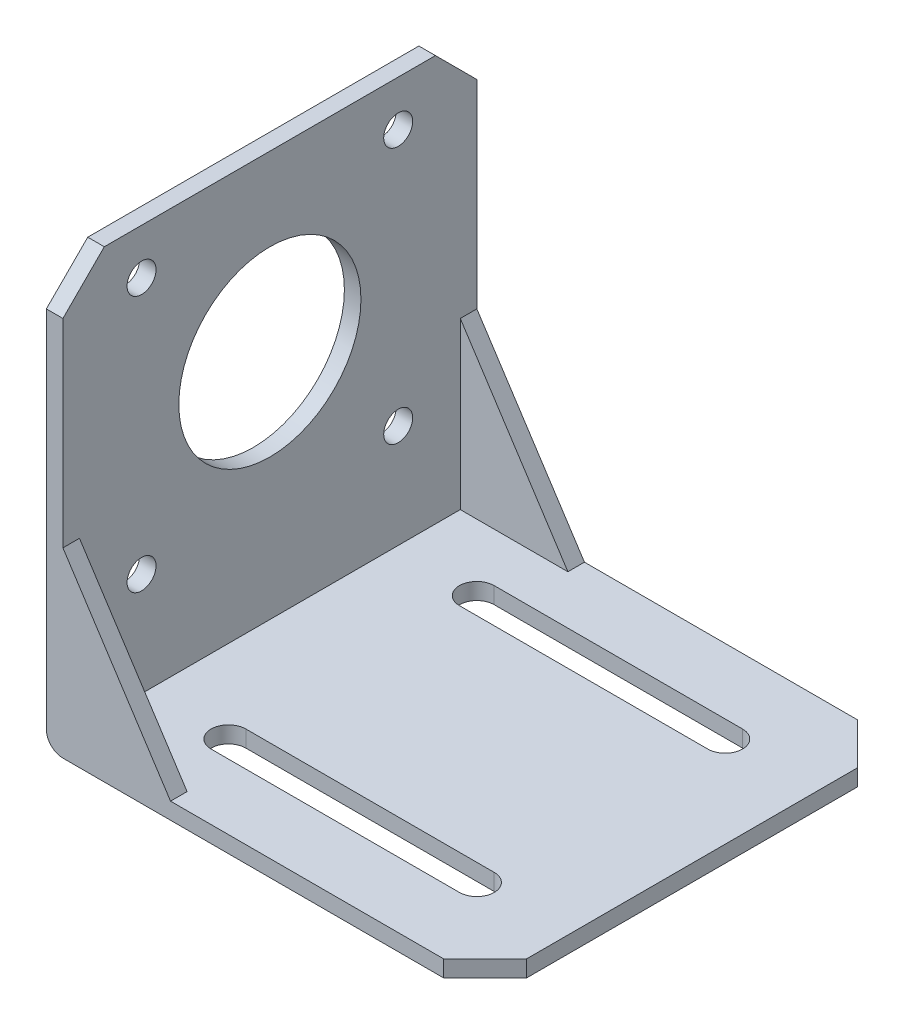
ISO-10303-21;
HEADER;
FILE_DESCRIPTION(('STEP AP214'),'2;1');
FILE_NAME('part.step','',(''),(''),'','','');
FILE_SCHEMA(('AUTOMOTIVE_DESIGN { 1 0 10303 214 1 1 1 1 }'));
ENDSEC;
DATA;
#1=APPLICATION_CONTEXT('core data for automotive mechanical design processes');
#2=APPLICATION_PROTOCOL_DEFINITION('international standard','automotive_design',2000,#1);
#3=PRODUCT_CONTEXT('',#1,'mechanical');
#4=PRODUCT('Part','Part','',(#3));
#5=PRODUCT_RELATED_PRODUCT_CATEGORY('part','',(#4));
#6=PRODUCT_DEFINITION_FORMATION('','',#4);
#7=PRODUCT_DEFINITION_CONTEXT('part definition',#1,'design');
#8=PRODUCT_DEFINITION('design','',#6,#7);
#9=PRODUCT_DEFINITION_SHAPE('','',#8);
#10=(LENGTH_UNIT() NAMED_UNIT(*) SI_UNIT(.MILLI.,.METRE.));
#11=(NAMED_UNIT(*) PLANE_ANGLE_UNIT() SI_UNIT($,.RADIAN.));
#12=(NAMED_UNIT(*) SI_UNIT($,.STERADIAN.) SOLID_ANGLE_UNIT());
#13=UNCERTAINTY_MEASURE_WITH_UNIT(LENGTH_MEASURE(1.E-05),#10,'distance_accuracy_value','');
#14=(GEOMETRIC_REPRESENTATION_CONTEXT(3) GLOBAL_UNCERTAINTY_ASSIGNED_CONTEXT((#13)) GLOBAL_UNIT_ASSIGNED_CONTEXT((#10,
#11,#12)) REPRESENTATION_CONTEXT('',''));
#15=CARTESIAN_POINT('',(0.,0.,0.));
#16=DIRECTION('',(0.,0.,1.));
#17=DIRECTION('',(1.,0.,0.));
#18=AXIS2_PLACEMENT_3D('',#15,#16,#17);
#19=CARTESIAN_POINT('',(0.,2.,0.));
#20=DIRECTION('',(0.,-1.,0.));
#21=DIRECTION('',(0.,0.,-1.));
#22=AXIS2_PLACEMENT_3D('',#19,#20,#21);
#23=PLANE('',#22);
#24=CARTESIAN_POINT('',(12.,2.,-15.));
#25=DIRECTION('',(0.,1.,0.));
#26=DIRECTION('',(0.,0.,1.));
#27=AXIS2_PLACEMENT_3D('',#24,#25,#26);
#28=CIRCLE('',#27,2.1);
#29=CARTESIAN_POINT('',(12.,2.,-17.1));
#30=VERTEX_POINT('',#29);
#31=CARTESIAN_POINT('',(12.,2.,-12.9));
#32=VERTEX_POINT('',#31);
#33=EDGE_CURVE('E406',#30,#32,#28,.T.);
#34=ORIENTED_EDGE('',*,*,#33,.F.);
#35=DIRECTION('',(-1.,0.,0.));
#36=VECTOR('',#35,1.);
#37=CARTESIAN_POINT('',(12.,2.,-17.1));
#38=LINE('',#37,#36);
#39=CARTESIAN_POINT('',(42.,2.,-17.1));
#40=VERTEX_POINT('',#39);
#41=EDGE_CURVE('E417',#40,#30,#38,.T.);
#42=ORIENTED_EDGE('',*,*,#41,.F.);
#43=CARTESIAN_POINT('',(42.,2.,-15.));
#44=DIRECTION('',(0.,1.,0.));
#45=DIRECTION('',(0.,0.,1.));
#46=AXIS2_PLACEMENT_3D('',#43,#44,#45);
#47=CIRCLE('',#46,2.1);
#48=CARTESIAN_POINT('',(42.,2.,-12.9));
#49=VERTEX_POINT('',#48);
#50=EDGE_CURVE('E413',#49,#40,#47,.T.);
#51=ORIENTED_EDGE('',*,*,#50,.F.);
#52=DIRECTION('',(1.,0.,0.));
#53=VECTOR('',#52,1.);
#54=CARTESIAN_POINT('',(12.,2.,-12.9));
#55=LINE('',#54,#53);
#56=EDGE_CURVE('E409',#32,#49,#55,.T.);
#57=ORIENTED_EDGE('',*,*,#56,.F.);
#58=EDGE_LOOP('',(#34,#42,#51,#57));
#59=FACE_BOUND('',#58,.T.);
#60=DIRECTION('',(-1.,0.,0.));
#61=VECTOR('',#60,1.);
#62=CARTESIAN_POINT('',(12.,2.,17.1));
#63=LINE('',#62,#61);
#64=CARTESIAN_POINT('',(42.,2.,17.1));
#65=VERTEX_POINT('',#64);
#66=CARTESIAN_POINT('',(12.,2.,17.1));
#67=VERTEX_POINT('',#66);
#68=EDGE_CURVE('E296',#65,#67,#63,.T.);
#69=ORIENTED_EDGE('',*,*,#68,.T.);
#70=CARTESIAN_POINT('',(12.,2.,15.));
#71=DIRECTION('',(0.,-1.,0.));
#72=DIRECTION('',(0.,0.,-1.));
#73=AXIS2_PLACEMENT_3D('',#70,#71,#72);
#74=CIRCLE('',#73,2.1);
#75=CARTESIAN_POINT('',(12.,2.,12.9));
#76=VERTEX_POINT('',#75);
#77=EDGE_CURVE('E292',#67,#76,#74,.T.);
#78=ORIENTED_EDGE('',*,*,#77,.T.);
#79=DIRECTION('',(1.,0.,0.));
#80=VECTOR('',#79,1.);
#81=CARTESIAN_POINT('',(12.,2.,12.9));
#82=LINE('',#81,#80);
#83=CARTESIAN_POINT('',(42.,2.,12.9));
#84=VERTEX_POINT('',#83);
#85=EDGE_CURVE('E305',#76,#84,#82,.T.);
#86=ORIENTED_EDGE('',*,*,#85,.T.);
#87=CARTESIAN_POINT('',(42.,2.,15.));
#88=DIRECTION('',(0.,-1.,0.));
#89=DIRECTION('',(0.,0.,-1.));
#90=AXIS2_PLACEMENT_3D('',#87,#88,#89);
#91=CIRCLE('',#90,2.1);
#92=EDGE_CURVE('E301',#84,#65,#91,.T.);
#93=ORIENTED_EDGE('',*,*,#92,.T.);
#94=EDGE_LOOP('',(#69,#78,#86,#93));
#95=FACE_BOUND('',#94,.T.);
#96=DIRECTION('',(0.,0.,-1.));
#97=VECTOR('',#96,1.);
#98=CARTESIAN_POINT('',(15.,2.,-23.));
#99=LINE('',#98,#97);
#100=CARTESIAN_POINT('',(15.,2.,-23.));
#101=VERTEX_POINT('',#100);
#102=CARTESIAN_POINT('',(15.,2.,-25.));
#103=VERTEX_POINT('',#102);
#104=EDGE_CURVE('E61',#101,#103,#99,.T.);
#105=ORIENTED_EDGE('',*,*,#104,.F.);
#106=DIRECTION('',(1.,0.,0.));
#107=VECTOR('',#106,1.);
#108=CARTESIAN_POINT('',(15.,2.,-23.));
#109=LINE('',#108,#107);
#110=CARTESIAN_POINT('',(2.,2.,-23.));
#111=VERTEX_POINT('',#110);
#112=EDGE_CURVE('E224',#111,#101,#109,.T.);
#113=ORIENTED_EDGE('',*,*,#112,.F.);
#114=DIRECTION('',(0.,0.,-1.));
#115=VECTOR('',#114,1.);
#116=CARTESIAN_POINT('',(2.,2.,0.));
#117=LINE('',#116,#115);
#118=CARTESIAN_POINT('',(2.,2.,23.));
#119=VERTEX_POINT('',#118);
#120=EDGE_CURVE('E208',#119,#111,#117,.T.);
#121=ORIENTED_EDGE('',*,*,#120,.F.);
#122=DIRECTION('',(1.,0.,0.));
#123=VECTOR('',#122,1.);
#124=CARTESIAN_POINT('',(15.,2.,23.));
#125=LINE('',#124,#123);
#126=CARTESIAN_POINT('',(15.,2.,23.));
#127=VERTEX_POINT('',#126);
#128=EDGE_CURVE('E235',#119,#127,#125,.T.);
#129=ORIENTED_EDGE('',*,*,#128,.T.);
#130=DIRECTION('',(0.,0.,1.));
#131=VECTOR('',#130,1.);
#132=CARTESIAN_POINT('',(15.,2.,23.));
#133=LINE('',#132,#131);
#134=CARTESIAN_POINT('',(15.,2.,25.));
#135=VERTEX_POINT('',#134);
#136=EDGE_CURVE('E246',#127,#135,#133,.T.);
#137=ORIENTED_EDGE('',*,*,#136,.T.);
#138=DIRECTION('',(-1.,0.,0.));
#139=VECTOR('',#138,1.);
#140=CARTESIAN_POINT('',(0.,2.,25.));
#141=LINE('',#140,#139);
#142=CARTESIAN_POINT('',(48.,2.,25.));
#143=VERTEX_POINT('',#142);
#144=EDGE_CURVE('E336',#143,#135,#141,.T.);
#145=ORIENTED_EDGE('',*,*,#144,.F.);
#146=DIRECTION('',(-0.707106781186546,0.,0.707106781186548));
#147=VECTOR('',#146,1.);
#148=CARTESIAN_POINT('',(48.,2.,25.));
#149=LINE('',#148,#147);
#150=CARTESIAN_POINT('',(53.,2.,20.));
#151=VERTEX_POINT('',#150);
#152=EDGE_CURVE('E340',#151,#143,#149,.T.);
#153=ORIENTED_EDGE('',*,*,#152,.F.);
#154=DIRECTION('',(0.,0.,-1.));
#155=VECTOR('',#154,1.);
#156=CARTESIAN_POINT('',(53.,2.,-20.));
#157=LINE('',#156,#155);
#158=CARTESIAN_POINT('',(53.,2.,-20.));
#159=VERTEX_POINT('',#158);
#160=EDGE_CURVE('E449',#151,#159,#157,.T.);
#161=ORIENTED_EDGE('',*,*,#160,.T.);
#162=DIRECTION('',(-0.707106781186546,0.,-0.707106781186548));
#163=VECTOR('',#162,1.);
#164=CARTESIAN_POINT('',(48.,2.,-25.));
#165=LINE('',#164,#163);
#166=CARTESIAN_POINT('',(48.,2.,-25.));
#167=VERTEX_POINT('',#166);
#168=EDGE_CURVE('E452',#159,#167,#165,.T.);
#169=ORIENTED_EDGE('',*,*,#168,.T.);
#170=DIRECTION('',(-1.,0.,0.));
#171=VECTOR('',#170,1.);
#172=CARTESIAN_POINT('',(0.,2.,-25.));
#173=LINE('',#172,#171);
#174=EDGE_CURVE('E66',#167,#103,#173,.T.);
#175=ORIENTED_EDGE('',*,*,#174,.T.);
#176=EDGE_LOOP('',(#105,#113,#121,#129,#137,#145,#153,#161,#169,#175));
#177=FACE_BOUND('',#176,.T.);
#178=ADVANCED_FACE('F45',(#59,#95,#177),#23,.F.);
#179=CARTESIAN_POINT('',(2.,0.,0.));
#180=DIRECTION('',(-1.,0.,0.));
#181=DIRECTION('',(0.,0.,1.));
#182=AXIS2_PLACEMENT_3D('',#179,#180,#181);
#183=PLANE('',#182);
#184=CARTESIAN_POINT('',(2.,14.5,15.5));
#185=DIRECTION('',(1.,0.,0.));
#186=DIRECTION('',(0.,0.,-1.));
#187=AXIS2_PLACEMENT_3D('',#184,#185,#186);
#188=CIRCLE('',#187,1.75);
#189=CARTESIAN_POINT('',(2.,14.5,13.75));
#190=VERTEX_POINT('',#189);
#191=EDGE_CURVE('E261',#190,#190,#188,.T.);
#192=ORIENTED_EDGE('',*,*,#191,.F.);
#193=EDGE_LOOP('',(#192));
#194=FACE_BOUND('',#193,.T.);
#195=CARTESIAN_POINT('',(2.,45.5,15.5));
#196=DIRECTION('',(1.,0.,0.));
#197=DIRECTION('',(0.,0.,-1.));
#198=AXIS2_PLACEMENT_3D('',#195,#196,#197);
#199=CIRCLE('',#198,1.75);
#200=CARTESIAN_POINT('',(2.,45.5,13.75));
#201=VERTEX_POINT('',#200);
#202=EDGE_CURVE('E257',#201,#201,#199,.T.);
#203=ORIENTED_EDGE('',*,*,#202,.F.);
#204=EDGE_LOOP('',(#203));
#205=FACE_BOUND('',#204,.T.);
#206=CARTESIAN_POINT('',(2.,14.5,-15.5));
#207=DIRECTION('',(-1.,0.,0.));
#208=DIRECTION('',(0.,0.,1.));
#209=AXIS2_PLACEMENT_3D('',#206,#207,#208);
#210=CIRCLE('',#209,1.75);
#211=CARTESIAN_POINT('',(2.,14.5,-13.75));
#212=VERTEX_POINT('',#211);
#213=EDGE_CURVE('E367',#212,#212,#210,.T.);
#214=ORIENTED_EDGE('',*,*,#213,.T.);
#215=EDGE_LOOP('',(#214));
#216=FACE_BOUND('',#215,.T.);
#217=CARTESIAN_POINT('',(2.,45.5,-15.5));
#218=DIRECTION('',(-1.,0.,0.));
#219=DIRECTION('',(0.,0.,1.));
#220=AXIS2_PLACEMENT_3D('',#217,#218,#219);
#221=CIRCLE('',#220,1.75);
#222=CARTESIAN_POINT('',(2.,45.5,-13.75));
#223=VERTEX_POINT('',#222);
#224=EDGE_CURVE('E363',#223,#223,#221,.T.);
#225=ORIENTED_EDGE('',*,*,#224,.T.);
#226=EDGE_LOOP('',(#225));
#227=FACE_BOUND('',#226,.T.);
#228=CARTESIAN_POINT('',(2.,30.,0.));
#229=DIRECTION('',(-1.,0.,0.));
#230=DIRECTION('',(0.,0.,1.));
#231=AXIS2_PLACEMENT_3D('',#228,#229,#230);
#232=CIRCLE('',#231,11.);
#233=CARTESIAN_POINT('',(2.,30.,11.));
#234=VERTEX_POINT('',#233);
#235=EDGE_CURVE('E372',#234,#234,#232,.T.);
#236=ORIENTED_EDGE('',*,*,#235,.T.);
#237=EDGE_LOOP('',(#236));
#238=FACE_BOUND('',#237,.T.);
#239=DIRECTION('',(0.,0.,-1.));
#240=VECTOR('',#239,1.);
#241=CARTESIAN_POINT('',(2.,22.,-23.));
#242=LINE('',#241,#240);
#243=CARTESIAN_POINT('',(2.,22.,-23.));
#244=VERTEX_POINT('',#243);
#245=CARTESIAN_POINT('',(2.,22.,-25.));
#246=VERTEX_POINT('',#245);
#247=EDGE_CURVE('E212',#244,#246,#242,.T.);
#248=ORIENTED_EDGE('',*,*,#247,.T.);
#249=DIRECTION('',(0.,1.,0.));
#250=VECTOR('',#249,1.);
#251=CARTESIAN_POINT('',(2.,0.,-25.));
#252=LINE('',#251,#250);
#253=CARTESIAN_POINT('',(2.,46.,-25.));
#254=VERTEX_POINT('',#253);
#255=EDGE_CURVE('E198',#246,#254,#252,.T.);
#256=ORIENTED_EDGE('',*,*,#255,.T.);
#257=DIRECTION('',(0.,0.707106781186549,0.707106781186546));
#258=VECTOR('',#257,1.);
#259=CARTESIAN_POINT('',(2.,35.4999999999999,-35.5000000000001));
#260=LINE('',#259,#258);
#261=CARTESIAN_POINT('',(2.,51.,-20.));
#262=VERTEX_POINT('',#261);
#263=EDGE_CURVE('E209',#254,#262,#260,.T.);
#264=ORIENTED_EDGE('',*,*,#263,.T.);
#265=DIRECTION('',(0.,0.,1.));
#266=VECTOR('',#265,1.);
#267=CARTESIAN_POINT('',(2.,51.,0.));
#268=LINE('',#267,#266);
#269=CARTESIAN_POINT('',(2.,51.,20.));
#270=VERTEX_POINT('',#269);
#271=EDGE_CURVE('E376',#262,#270,#268,.T.);
#272=ORIENTED_EDGE('',*,*,#271,.T.);
#273=DIRECTION('',(0.,0.707106781186549,-0.707106781186546));
#274=VECTOR('',#273,1.);
#275=CARTESIAN_POINT('',(2.,35.4999999999999,35.5000000000001));
#276=LINE('',#275,#274);
#277=CARTESIAN_POINT('',(2.,46.,25.));
#278=VERTEX_POINT('',#277);
#279=EDGE_CURVE('E269',#278,#270,#276,.T.);
#280=ORIENTED_EDGE('',*,*,#279,.F.);
#281=DIRECTION('',(0.,1.,0.));
#282=VECTOR('',#281,1.);
#283=CARTESIAN_POINT('',(2.,0.,25.));
#284=LINE('',#283,#282);
#285=CARTESIAN_POINT('',(2.,22.,25.));
#286=VERTEX_POINT('',#285);
#287=EDGE_CURVE('E266',#286,#278,#284,.T.);
#288=ORIENTED_EDGE('',*,*,#287,.F.);
#289=DIRECTION('',(0.,0.,1.));
#290=VECTOR('',#289,1.);
#291=CARTESIAN_POINT('',(2.,22.,23.));
#292=LINE('',#291,#290);
#293=CARTESIAN_POINT('',(2.,22.,23.));
#294=VERTEX_POINT('',#293);
#295=EDGE_CURVE('E249',#294,#286,#292,.T.);
#296=ORIENTED_EDGE('',*,*,#295,.F.);
#297=DIRECTION('',(0.,-1.,0.));
#298=VECTOR('',#297,1.);
#299=CARTESIAN_POINT('',(2.,2.,23.));
#300=LINE('',#299,#298);
#301=EDGE_CURVE('E242',#294,#119,#300,.T.);
#302=ORIENTED_EDGE('',*,*,#301,.T.);
#303=ORIENTED_EDGE('',*,*,#120,.T.);
#304=DIRECTION('',(0.,-1.,0.));
#305=VECTOR('',#304,1.);
#306=CARTESIAN_POINT('',(2.,2.,-23.));
#307=LINE('',#306,#305);
#308=EDGE_CURVE('E216',#244,#111,#307,.T.);
#309=ORIENTED_EDGE('',*,*,#308,.F.);
#310=EDGE_LOOP('',(#248,#256,#264,#272,#280,#288,#296,#302,#303,#309));
#311=FACE_BOUND('',#310,.T.);
#312=ADVANCED_FACE('F213',(#194,#205,#216,#227,#238,#311),#183,.F.);
#313=CARTESIAN_POINT('',(0.,0.,0.));
#314=DIRECTION('',(0.,-1.,0.));
#315=DIRECTION('',(0.,0.,-1.));
#316=AXIS2_PLACEMENT_3D('',#313,#314,#315);
#317=PLANE('',#316);
#318=DIRECTION('',(-1.,0.,0.));
#319=VECTOR('',#318,1.);
#320=CARTESIAN_POINT('',(0.,0.,25.));
#321=LINE('',#320,#319);
#322=CARTESIAN_POINT('',(48.,0.,25.));
#323=VERTEX_POINT('',#322);
#324=CARTESIAN_POINT('',(2.,0.,25.));
#325=VERTEX_POINT('',#324);
#326=EDGE_CURVE('E335',#323,#325,#321,.T.);
#327=ORIENTED_EDGE('',*,*,#326,.T.);
#328=DIRECTION('',(0.,0.,1.));
#329=VECTOR('',#328,1.);
#330=CARTESIAN_POINT('',(2.,0.,-25.));
#331=LINE('',#330,#329);
#332=CARTESIAN_POINT('',(2.,0.,-25.));
#333=VERTEX_POINT('',#332);
#334=EDGE_CURVE('E54',#325,#333,#331,.F.);
#335=ORIENTED_EDGE('',*,*,#334,.T.);
#336=DIRECTION('',(-1.,0.,0.));
#337=VECTOR('',#336,1.);
#338=CARTESIAN_POINT('',(0.,0.,-25.));
#339=LINE('',#338,#337);
#340=CARTESIAN_POINT('',(48.,0.,-25.));
#341=VERTEX_POINT('',#340);
#342=EDGE_CURVE('E453',#341,#333,#339,.T.);
#343=ORIENTED_EDGE('',*,*,#342,.F.);
#344=DIRECTION('',(-0.707106781186546,0.,-0.707106781186548));
#345=VECTOR('',#344,1.);
#346=CARTESIAN_POINT('',(48.,0.,-25.));
#347=LINE('',#346,#345);
#348=CARTESIAN_POINT('',(53.,0.,-20.));
#349=VERTEX_POINT('',#348);
#350=EDGE_CURVE('E461',#349,#341,#347,.T.);
#351=ORIENTED_EDGE('',*,*,#350,.F.);
#352=DIRECTION('',(0.,0.,-1.));
#353=VECTOR('',#352,1.);
#354=CARTESIAN_POINT('',(53.,0.,-20.));
#355=LINE('',#354,#353);
#356=CARTESIAN_POINT('',(53.,0.,20.));
#357=VERTEX_POINT('',#356);
#358=EDGE_CURVE('E448',#357,#349,#355,.T.);
#359=ORIENTED_EDGE('',*,*,#358,.F.);
#360=DIRECTION('',(-0.707106781186546,0.,0.707106781186548));
#361=VECTOR('',#360,1.);
#362=CARTESIAN_POINT('',(48.,0.,25.));
#363=LINE('',#362,#361);
#364=EDGE_CURVE('E341',#357,#323,#363,.T.);
#365=ORIENTED_EDGE('',*,*,#364,.T.);
#366=EDGE_LOOP('',(#327,#335,#343,#351,#359,#365));
#367=FACE_BOUND('',#366,.T.);
#368=DIRECTION('',(-1.,0.,0.));
#369=VECTOR('',#368,1.);
#370=CARTESIAN_POINT('',(12.,0.,-17.1));
#371=LINE('',#370,#369);
#372=CARTESIAN_POINT('',(42.,0.,-17.1));
#373=VERTEX_POINT('',#372);
#374=CARTESIAN_POINT('',(12.,0.,-17.1));
#375=VERTEX_POINT('',#374);
#376=EDGE_CURVE('E410',#373,#375,#371,.T.);
#377=ORIENTED_EDGE('',*,*,#376,.T.);
#378=CARTESIAN_POINT('',(12.,0.,-15.));
#379=DIRECTION('',(0.,1.,0.));
#380=DIRECTION('',(0.,0.,1.));
#381=AXIS2_PLACEMENT_3D('',#378,#379,#380);
#382=CIRCLE('',#381,2.1);
#383=CARTESIAN_POINT('',(12.,0.,-12.9));
#384=VERTEX_POINT('',#383);
#385=EDGE_CURVE('E402',#375,#384,#382,.T.);
#386=ORIENTED_EDGE('',*,*,#385,.T.);
#387=DIRECTION('',(1.,0.,0.));
#388=VECTOR('',#387,1.);
#389=CARTESIAN_POINT('',(12.,0.,-12.9));
#390=LINE('',#389,#388);
#391=CARTESIAN_POINT('',(42.,0.,-12.9));
#392=VERTEX_POINT('',#391);
#393=EDGE_CURVE('E424',#384,#392,#390,.T.);
#394=ORIENTED_EDGE('',*,*,#393,.T.);
#395=CARTESIAN_POINT('',(42.,0.,-15.));
#396=DIRECTION('',(0.,1.,0.));
#397=DIRECTION('',(0.,0.,1.));
#398=AXIS2_PLACEMENT_3D('',#395,#396,#397);
#399=CIRCLE('',#398,2.1);
#400=EDGE_CURVE('E428',#392,#373,#399,.T.);
#401=ORIENTED_EDGE('',*,*,#400,.T.);
#402=EDGE_LOOP('',(#377,#386,#394,#401));
#403=FACE_BOUND('',#402,.T.);
#404=CARTESIAN_POINT('',(12.,0.,15.));
#405=DIRECTION('',(0.,-1.,0.));
#406=DIRECTION('',(0.,0.,-1.));
#407=AXIS2_PLACEMENT_3D('',#404,#405,#406);
#408=CIRCLE('',#407,2.1);
#409=CARTESIAN_POINT('',(12.,0.,17.1));
#410=VERTEX_POINT('',#409);
#411=CARTESIAN_POINT('',(12.,0.,12.9));
#412=VERTEX_POINT('',#411);
#413=EDGE_CURVE('E288',#410,#412,#408,.T.);
#414=ORIENTED_EDGE('',*,*,#413,.F.);
#415=DIRECTION('',(-1.,0.,0.));
#416=VECTOR('',#415,1.);
#417=CARTESIAN_POINT('',(12.,0.,17.1));
#418=LINE('',#417,#416);
#419=CARTESIAN_POINT('',(42.,0.,17.1));
#420=VERTEX_POINT('',#419);
#421=EDGE_CURVE('E312',#420,#410,#418,.T.);
#422=ORIENTED_EDGE('',*,*,#421,.F.);
#423=CARTESIAN_POINT('',(42.,0.,15.));
#424=DIRECTION('',(0.,-1.,0.));
#425=DIRECTION('',(0.,0.,-1.));
#426=AXIS2_PLACEMENT_3D('',#423,#424,#425);
#427=CIRCLE('',#426,2.1);
#428=CARTESIAN_POINT('',(42.,0.,12.9));
#429=VERTEX_POINT('',#428);
#430=EDGE_CURVE('E316',#429,#420,#427,.T.);
#431=ORIENTED_EDGE('',*,*,#430,.F.);
#432=DIRECTION('',(1.,0.,0.));
#433=VECTOR('',#432,1.);
#434=CARTESIAN_POINT('',(12.,0.,12.9));
#435=LINE('',#434,#433);
#436=EDGE_CURVE('E297',#412,#429,#435,.T.);
#437=ORIENTED_EDGE('',*,*,#436,.F.);
#438=EDGE_LOOP('',(#414,#422,#431,#437));
#439=FACE_BOUND('',#438,.T.);
#440=ADVANCED_FACE('F488',(#367,#403,#439),#317,.T.);
#441=CARTESIAN_POINT('',(53.,2.,-20.));
#442=DIRECTION('',(-1.,0.,0.));
#443=DIRECTION('',(0.,0.,1.));
#444=AXIS2_PLACEMENT_3D('',#441,#442,#443);
#445=PLANE('',#444);
#446=ORIENTED_EDGE('',*,*,#358,.T.);
#447=DIRECTION('',(0.,-1.,0.));
#448=VECTOR('',#447,1.);
#449=CARTESIAN_POINT('',(53.,2.,-20.));
#450=LINE('',#449,#448);
#451=EDGE_CURVE('E474',#159,#349,#450,.T.);
#452=ORIENTED_EDGE('',*,*,#451,.F.);
#453=ORIENTED_EDGE('',*,*,#160,.F.);
#454=DIRECTION('',(0.,-1.,0.));
#455=VECTOR('',#454,1.);
#456=CARTESIAN_POINT('',(53.,2.,20.));
#457=LINE('',#456,#455);
#458=EDGE_CURVE('E345',#151,#357,#457,.T.);
#459=ORIENTED_EDGE('',*,*,#458,.T.);
#460=EDGE_LOOP('',(#446,#452,#453,#459));
#461=FACE_BOUND('',#460,.T.);
#462=ADVANCED_FACE('F551',(#461),#445,.F.);
#463=CARTESIAN_POINT('',(48.,2.,-25.));
#464=DIRECTION('',(-0.707106781186549,0.,0.707106781186547));
#465=DIRECTION('',(0.707106781186546,0.,0.707106781186549));
#466=AXIS2_PLACEMENT_3D('',#463,#464,#465);
#467=PLANE('',#466);
#468=ORIENTED_EDGE('',*,*,#350,.T.);
#469=DIRECTION('',(0.,-1.,0.));
#470=VECTOR('',#469,1.);
#471=CARTESIAN_POINT('',(48.,2.,-25.));
#472=LINE('',#471,#470);
#473=EDGE_CURVE('E470',#167,#341,#472,.T.);
#474=ORIENTED_EDGE('',*,*,#473,.F.);
#475=ORIENTED_EDGE('',*,*,#168,.F.);
#476=ORIENTED_EDGE('',*,*,#451,.T.);
#477=EDGE_LOOP('',(#468,#474,#475,#476));
#478=FACE_BOUND('',#477,.T.);
#479=ADVANCED_FACE('F556',(#478),#467,.F.);
#480=CARTESIAN_POINT('',(0.,2.,-25.));
#481=DIRECTION('',(0.,0.,1.));
#482=DIRECTION('',(1.,0.,0.));
#483=AXIS2_PLACEMENT_3D('',#480,#481,#482);
#484=PLANE('',#483);
#485=DIRECTION('',(-0.544988350595414,0.838443616300637,0.));
#486=VECTOR('',#485,1.);
#487=CARTESIAN_POINT('',(2.,22.,-25.));
#488=LINE('',#487,#486);
#489=EDGE_CURVE('E202',#103,#246,#488,.T.);
#490=ORIENTED_EDGE('',*,*,#489,.F.);
#491=ORIENTED_EDGE('',*,*,#174,.F.);
#492=ORIENTED_EDGE('',*,*,#473,.T.);
#493=ORIENTED_EDGE('',*,*,#342,.T.);
#494=CARTESIAN_POINT('',(2.,2.,-25.));
#495=DIRECTION('',(0.,0.,1.));
#496=DIRECTION('',(1.,0.,0.));
#497=AXIS2_PLACEMENT_3D('',#494,#495,#496);
#498=CIRCLE('',#497,2.);
#499=CARTESIAN_POINT('',(0.,2.,-25.));
#500=VERTEX_POINT('',#499);
#501=EDGE_CURVE('E11',#333,#500,#498,.F.);
#502=ORIENTED_EDGE('',*,*,#501,.T.);
#503=DIRECTION('',(0.,-1.,0.));
#504=VECTOR('',#503,1.);
#505=CARTESIAN_POINT('',(0.,2.,-25.));
#506=LINE('',#505,#504);
#507=CARTESIAN_POINT('',(0.,46.,-25.));
#508=VERTEX_POINT('',#507);
#509=EDGE_CURVE('E458',#508,#500,#506,.T.);
#510=ORIENTED_EDGE('',*,*,#509,.F.);
#511=DIRECTION('',(-1.,0.,0.));
#512=VECTOR('',#511,1.);
#513=CARTESIAN_POINT('',(2.,46.,-25.));
#514=LINE('',#513,#512);
#515=EDGE_CURVE('E204',#254,#508,#514,.T.);
#516=ORIENTED_EDGE('',*,*,#515,.F.);
#517=ORIENTED_EDGE('',*,*,#255,.F.);
#518=EDGE_LOOP('',(#490,#491,#492,#493,#502,#510,#516,#517));
#519=FACE_BOUND('',#518,.T.);
#520=ADVANCED_FACE('F200',(#519),#484,.F.);
#521=CARTESIAN_POINT('',(0.,2.,0.));
#522=DIRECTION('',(1.,0.,0.));
#523=DIRECTION('',(0.,0.,-1.));
#524=AXIS2_PLACEMENT_3D('',#521,#522,#523);
#525=PLANE('',#524);
#526=ORIENTED_EDGE('',*,*,#509,.T.);
#527=DIRECTION('',(0.,0.,1.));
#528=VECTOR('',#527,1.);
#529=CARTESIAN_POINT('',(0.,2.,25.));
#530=LINE('',#529,#528);
#531=CARTESIAN_POINT('',(0.,2.,25.));
#532=VERTEX_POINT('',#531);
#533=EDGE_CURVE('E478',#500,#532,#530,.T.);
#534=ORIENTED_EDGE('',*,*,#533,.T.);
#535=DIRECTION('',(0.,-1.,0.));
#536=VECTOR('',#535,1.);
#537=CARTESIAN_POINT('',(0.,2.,25.));
#538=LINE('',#537,#536);
#539=CARTESIAN_POINT('',(0.,46.,25.));
#540=VERTEX_POINT('',#539);
#541=EDGE_CURVE('E358',#540,#532,#538,.T.);
#542=ORIENTED_EDGE('',*,*,#541,.F.);
#543=DIRECTION('',(0.,0.707106781186549,-0.707106781186546));
#544=VECTOR('',#543,1.);
#545=CARTESIAN_POINT('',(0.,35.4999999999999,35.5000000000001));
#546=LINE('',#545,#544);
#547=CARTESIAN_POINT('',(0.,51.,20.));
#548=VERTEX_POINT('',#547);
#549=EDGE_CURVE('E262',#540,#548,#546,.T.);
#550=ORIENTED_EDGE('',*,*,#549,.T.);
#551=DIRECTION('',(0.,0.,1.));
#552=VECTOR('',#551,1.);
#553=CARTESIAN_POINT('',(0.,51.,0.));
#554=LINE('',#553,#552);
#555=CARTESIAN_POINT('',(0.,51.,-20.));
#556=VERTEX_POINT('',#555);
#557=EDGE_CURVE('E395',#556,#548,#554,.T.);
#558=ORIENTED_EDGE('',*,*,#557,.F.);
#559=DIRECTION('',(0.,0.707106781186549,0.707106781186546));
#560=VECTOR('',#559,1.);
#561=CARTESIAN_POINT('',(0.,35.4999999999999,-35.5000000000001));
#562=LINE('',#561,#560);
#563=EDGE_CURVE('E368',#508,#556,#562,.T.);
#564=ORIENTED_EDGE('',*,*,#563,.F.);
#565=EDGE_LOOP('',(#526,#534,#542,#550,#558,#564));
#566=FACE_BOUND('',#565,.T.);
#567=CARTESIAN_POINT('',(0.,30.,0.));
#568=DIRECTION('',(-1.,0.,0.));
#569=DIRECTION('',(0.,0.,1.));
#570=AXIS2_PLACEMENT_3D('',#567,#568,#569);
#571=CIRCLE('',#570,11.);
#572=CARTESIAN_POINT('',(0.,30.,11.));
#573=VERTEX_POINT('',#572);
#574=EDGE_CURVE('E391',#573,#573,#571,.T.);
#575=ORIENTED_EDGE('',*,*,#574,.F.);
#576=EDGE_LOOP('',(#575));
#577=FACE_BOUND('',#576,.T.);
#578=CARTESIAN_POINT('',(0.,45.5,-15.5));
#579=DIRECTION('',(-1.,0.,0.));
#580=DIRECTION('',(0.,0.,1.));
#581=AXIS2_PLACEMENT_3D('',#578,#579,#580);
#582=CIRCLE('',#581,1.75);
#583=CARTESIAN_POINT('',(0.,45.5,-13.75));
#584=VERTEX_POINT('',#583);
#585=EDGE_CURVE('E362',#584,#584,#582,.T.);
#586=ORIENTED_EDGE('',*,*,#585,.F.);
#587=EDGE_LOOP('',(#586));
#588=FACE_BOUND('',#587,.T.);
#589=CARTESIAN_POINT('',(0.,14.5,-15.5));
#590=DIRECTION('',(-1.,0.,0.));
#591=DIRECTION('',(0.,0.,1.));
#592=AXIS2_PLACEMENT_3D('',#589,#590,#591);
#593=CIRCLE('',#592,1.75);
#594=CARTESIAN_POINT('',(0.,14.5,-13.75));
#595=VERTEX_POINT('',#594);
#596=EDGE_CURVE('E387',#595,#595,#593,.T.);
#597=ORIENTED_EDGE('',*,*,#596,.F.);
#598=EDGE_LOOP('',(#597));
#599=FACE_BOUND('',#598,.T.);
#600=CARTESIAN_POINT('',(0.,45.5,15.5));
#601=DIRECTION('',(1.,0.,0.));
#602=DIRECTION('',(0.,0.,-1.));
#603=AXIS2_PLACEMENT_3D('',#600,#601,#602);
#604=CIRCLE('',#603,1.75);
#605=CARTESIAN_POINT('',(0.,45.5,13.75));
#606=VERTEX_POINT('',#605);
#607=EDGE_CURVE('E253',#606,#606,#604,.T.);
#608=ORIENTED_EDGE('',*,*,#607,.T.);
#609=EDGE_LOOP('',(#608));
#610=FACE_BOUND('',#609,.T.);
#611=CARTESIAN_POINT('',(0.,14.5,15.5));
#612=DIRECTION('',(1.,0.,0.));
#613=DIRECTION('',(0.,0.,-1.));
#614=AXIS2_PLACEMENT_3D('',#611,#612,#613);
#615=CIRCLE('',#614,1.75);
#616=CARTESIAN_POINT('',(0.,14.5,13.75));
#617=VERTEX_POINT('',#616);
#618=EDGE_CURVE('E277',#617,#617,#615,.T.);
#619=ORIENTED_EDGE('',*,*,#618,.T.);
#620=EDGE_LOOP('',(#619));
#621=FACE_BOUND('',#620,.T.);
#622=ADVANCED_FACE('F497',(#566,#577,#588,#599,#610,#621),#525,.F.);
#623=CARTESIAN_POINT('',(12.,2.,-15.));
#624=DIRECTION('',(0.,-1.,0.));
#625=DIRECTION('',(0.,0.,-1.));
#626=AXIS2_PLACEMENT_3D('',#623,#624,#625);
#627=CYLINDRICAL_SURFACE('',#626,2.1);
#628=ORIENTED_EDGE('',*,*,#385,.F.);
#629=DIRECTION('',(0.,-1.,0.));
#630=VECTOR('',#629,1.);
#631=CARTESIAN_POINT('',(12.,2.,-17.1));
#632=LINE('',#631,#630);
#633=EDGE_CURVE('E420',#30,#375,#632,.T.);
#634=ORIENTED_EDGE('',*,*,#633,.F.);
#635=ORIENTED_EDGE('',*,*,#33,.T.);
#636=DIRECTION('',(0.,-1.,0.));
#637=VECTOR('',#636,1.);
#638=CARTESIAN_POINT('',(12.,2.,-12.9));
#639=LINE('',#638,#637);
#640=EDGE_CURVE('E444',#32,#384,#639,.T.);
#641=ORIENTED_EDGE('',*,*,#640,.T.);
#642=EDGE_LOOP('',(#628,#634,#635,#641));
#643=FACE_BOUND('',#642,.T.);
#644=ADVANCED_FACE('F547',(#643),#627,.F.);
#645=CARTESIAN_POINT('',(12.,2.,-12.9));
#646=DIRECTION('',(0.,0.,-1.));
#647=DIRECTION('',(-1.,0.,0.));
#648=AXIS2_PLACEMENT_3D('',#645,#646,#647);
#649=PLANE('',#648);
#650=ORIENTED_EDGE('',*,*,#393,.F.);
#651=ORIENTED_EDGE('',*,*,#640,.F.);
#652=ORIENTED_EDGE('',*,*,#56,.T.);
#653=DIRECTION('',(0.,-1.,0.));
#654=VECTOR('',#653,1.);
#655=CARTESIAN_POINT('',(42.,2.,-12.9));
#656=LINE('',#655,#654);
#657=EDGE_CURVE('E441',#49,#392,#656,.T.);
#658=ORIENTED_EDGE('',*,*,#657,.T.);
#659=EDGE_LOOP('',(#650,#651,#652,#658));
#660=FACE_BOUND('',#659,.T.);
#661=ADVANCED_FACE('F605',(#660),#649,.T.);
#662=CARTESIAN_POINT('',(42.,2.,-15.));
#663=DIRECTION('',(0.,-1.,0.));
#664=DIRECTION('',(0.,0.,-1.));
#665=AXIS2_PLACEMENT_3D('',#662,#663,#664);
#666=CYLINDRICAL_SURFACE('',#665,2.1);
#667=ORIENTED_EDGE('',*,*,#400,.F.);
#668=ORIENTED_EDGE('',*,*,#657,.F.);
#669=ORIENTED_EDGE('',*,*,#50,.T.);
#670=DIRECTION('',(0.,-1.,0.));
#671=VECTOR('',#670,1.);
#672=CARTESIAN_POINT('',(42.,2.,-17.1));
#673=LINE('',#672,#671);
#674=EDGE_CURVE('E438',#40,#373,#673,.T.);
#675=ORIENTED_EDGE('',*,*,#674,.T.);
#676=EDGE_LOOP('',(#667,#668,#669,#675));
#677=FACE_BOUND('',#676,.T.);
#678=ADVANCED_FACE('F602',(#677),#666,.F.);
#679=CARTESIAN_POINT('',(12.,2.,-17.1));
#680=DIRECTION('',(0.,0.,1.));
#681=DIRECTION('',(1.,0.,0.));
#682=AXIS2_PLACEMENT_3D('',#679,#680,#681);
#683=PLANE('',#682);
#684=ORIENTED_EDGE('',*,*,#376,.F.);
#685=ORIENTED_EDGE('',*,*,#674,.F.);
#686=ORIENTED_EDGE('',*,*,#41,.T.);
#687=ORIENTED_EDGE('',*,*,#633,.T.);
#688=EDGE_LOOP('',(#684,#685,#686,#687));
#689=FACE_BOUND('',#688,.T.);
#690=ADVANCED_FACE('F592',(#689),#683,.T.);
#691=CARTESIAN_POINT('',(2.,30.,0.));
#692=DIRECTION('',(-1.,0.,0.));
#693=DIRECTION('',(0.,0.,1.));
#694=AXIS2_PLACEMENT_3D('',#691,#692,#693);
#695=CYLINDRICAL_SURFACE('',#694,11.);
#696=ORIENTED_EDGE('',*,*,#574,.T.);
#697=EDGE_LOOP('',(#696));
#698=FACE_BOUND('',#697,.T.);
#699=ORIENTED_EDGE('',*,*,#235,.F.);
#700=EDGE_LOOP('',(#699));
#701=FACE_BOUND('',#700,.T.);
#702=ADVANCED_FACE('F586',(#698,#701),#695,.F.);
#703=CARTESIAN_POINT('',(2.,35.4999999999999,-35.5000000000001));
#704=DIRECTION('',(0.,-0.707106781186546,0.707106781186549));
#705=DIRECTION('',(0.,-0.707106781186549,-0.707106781186546));
#706=AXIS2_PLACEMENT_3D('',#703,#704,#705);
#707=PLANE('',#706);
#708=ORIENTED_EDGE('',*,*,#563,.T.);
#709=DIRECTION('',(-1.,0.,0.));
#710=VECTOR('',#709,1.);
#711=CARTESIAN_POINT('',(2.,51.,-20.));
#712=LINE('',#711,#710);
#713=EDGE_CURVE('E383',#262,#556,#712,.T.);
#714=ORIENTED_EDGE('',*,*,#713,.F.);
#715=ORIENTED_EDGE('',*,*,#263,.F.);
#716=ORIENTED_EDGE('',*,*,#515,.T.);
#717=EDGE_LOOP('',(#708,#714,#715,#716));
#718=FACE_BOUND('',#717,.T.);
#719=ADVANCED_FACE('F515',(#718),#707,.F.);
#720=CARTESIAN_POINT('',(2.,51.,0.));
#721=DIRECTION('',(0.,-1.,0.));
#722=DIRECTION('',(0.,0.,-1.));
#723=AXIS2_PLACEMENT_3D('',#720,#721,#722);
#724=PLANE('',#723);
#725=ORIENTED_EDGE('',*,*,#557,.T.);
#726=DIRECTION('',(-1.,0.,0.));
#727=VECTOR('',#726,1.);
#728=CARTESIAN_POINT('',(2.,51.,20.));
#729=LINE('',#728,#727);
#730=EDGE_CURVE('E284',#270,#548,#729,.T.);
#731=ORIENTED_EDGE('',*,*,#730,.F.);
#732=ORIENTED_EDGE('',*,*,#271,.F.);
#733=ORIENTED_EDGE('',*,*,#713,.T.);
#734=EDGE_LOOP('',(#725,#731,#732,#733));
#735=FACE_BOUND('',#734,.T.);
#736=ADVANCED_FACE('F511',(#735),#724,.F.);
#737=CARTESIAN_POINT('',(2.,14.5,-15.5));
#738=DIRECTION('',(-1.,0.,0.));
#739=DIRECTION('',(0.,0.,1.));
#740=AXIS2_PLACEMENT_3D('',#737,#738,#739);
#741=CYLINDRICAL_SURFACE('',#740,1.75);
#742=ORIENTED_EDGE('',*,*,#213,.F.);
#743=EDGE_LOOP('',(#742));
#744=FACE_BOUND('',#743,.T.);
#745=ORIENTED_EDGE('',*,*,#596,.T.);
#746=EDGE_LOOP('',(#745));
#747=FACE_BOUND('',#746,.T.);
#748=ADVANCED_FACE('F589',(#744,#747),#741,.F.);
#749=CARTESIAN_POINT('',(2.,45.5,-15.5));
#750=DIRECTION('',(-1.,0.,0.));
#751=DIRECTION('',(0.,0.,1.));
#752=AXIS2_PLACEMENT_3D('',#749,#750,#751);
#753=CYLINDRICAL_SURFACE('',#752,1.75);
#754=ORIENTED_EDGE('',*,*,#224,.F.);
#755=EDGE_LOOP('',(#754));
#756=FACE_BOUND('',#755,.T.);
#757=ORIENTED_EDGE('',*,*,#585,.T.);
#758=EDGE_LOOP('',(#757));
#759=FACE_BOUND('',#758,.T.);
#760=ADVANCED_FACE('F580',(#756,#759),#753,.F.);
#761=CARTESIAN_POINT('',(0.,2.,25.));
#762=DIRECTION('',(0.,0.,1.));
#763=DIRECTION('',(1.,0.,0.));
#764=AXIS2_PLACEMENT_3D('',#761,#762,#763);
#765=PLANE('',#764);
#766=ORIENTED_EDGE('',*,*,#144,.T.);
#767=DIRECTION('',(-0.544988350595414,0.838443616300637,0.));
#768=VECTOR('',#767,1.);
#769=CARTESIAN_POINT('',(2.,22.,25.));
#770=LINE('',#769,#768);
#771=EDGE_CURVE('E233',#135,#286,#770,.T.);
#772=ORIENTED_EDGE('',*,*,#771,.T.);
#773=ORIENTED_EDGE('',*,*,#287,.T.);
#774=DIRECTION('',(-1.,0.,0.));
#775=VECTOR('',#774,1.);
#776=CARTESIAN_POINT('',(2.,46.,25.));
#777=LINE('',#776,#775);
#778=EDGE_CURVE('E273',#278,#540,#777,.T.);
#779=ORIENTED_EDGE('',*,*,#778,.T.);
#780=ORIENTED_EDGE('',*,*,#541,.T.);
#781=CARTESIAN_POINT('',(2.,2.,25.));
#782=DIRECTION('',(0.,0.,1.));
#783=DIRECTION('',(1.,0.,0.));
#784=AXIS2_PLACEMENT_3D('',#781,#782,#783);
#785=CIRCLE('',#784,2.);
#786=EDGE_CURVE('E482',#532,#325,#785,.T.);
#787=ORIENTED_EDGE('',*,*,#786,.T.);
#788=ORIENTED_EDGE('',*,*,#326,.F.);
#789=DIRECTION('',(0.,-1.,0.));
#790=VECTOR('',#789,1.);
#791=CARTESIAN_POINT('',(48.,2.,25.));
#792=LINE('',#791,#790);
#793=EDGE_CURVE('E355',#143,#323,#792,.T.);
#794=ORIENTED_EDGE('',*,*,#793,.F.);
#795=EDGE_LOOP('',(#766,#772,#773,#779,#780,#787,#788,#794));
#796=FACE_BOUND('',#795,.T.);
#797=ADVANCED_FACE('F501',(#796),#765,.T.);
#798=CARTESIAN_POINT('',(48.,2.,25.));
#799=DIRECTION('',(0.707106781186549,0.,0.707106781186547));
#800=DIRECTION('',(0.707106781186546,0.,-0.707106781186549));
#801=AXIS2_PLACEMENT_3D('',#798,#799,#800);
#802=PLANE('',#801);
#803=ORIENTED_EDGE('',*,*,#364,.F.);
#804=ORIENTED_EDGE('',*,*,#458,.F.);
#805=ORIENTED_EDGE('',*,*,#152,.T.);
#806=ORIENTED_EDGE('',*,*,#793,.T.);
#807=EDGE_LOOP('',(#803,#804,#805,#806));
#808=FACE_BOUND('',#807,.T.);
#809=ADVANCED_FACE('F569',(#808),#802,.T.);
#810=CARTESIAN_POINT('',(12.,2.,15.));
#811=DIRECTION('',(0.,-1.,0.));
#812=DIRECTION('',(0.,0.,-1.));
#813=AXIS2_PLACEMENT_3D('',#810,#811,#812);
#814=CYLINDRICAL_SURFACE('',#813,2.1);
#815=ORIENTED_EDGE('',*,*,#413,.T.);
#816=DIRECTION('',(0.,-1.,0.));
#817=VECTOR('',#816,1.);
#818=CARTESIAN_POINT('',(12.,2.,12.9));
#819=LINE('',#818,#817);
#820=EDGE_CURVE('E309',#76,#412,#819,.T.);
#821=ORIENTED_EDGE('',*,*,#820,.F.);
#822=ORIENTED_EDGE('',*,*,#77,.F.);
#823=DIRECTION('',(0.,-1.,0.));
#824=VECTOR('',#823,1.);
#825=CARTESIAN_POINT('',(12.,2.,17.1));
#826=LINE('',#825,#824);
#827=EDGE_CURVE('E332',#67,#410,#826,.T.);
#828=ORIENTED_EDGE('',*,*,#827,.T.);
#829=EDGE_LOOP('',(#815,#821,#822,#828));
#830=FACE_BOUND('',#829,.T.);
#831=ADVANCED_FACE('F571',(#830),#814,.F.);
#832=CARTESIAN_POINT('',(12.,2.,17.1));
#833=DIRECTION('',(0.,0.,1.));
#834=DIRECTION('',(1.,0.,0.));
#835=AXIS2_PLACEMENT_3D('',#832,#833,#834);
#836=PLANE('',#835);
#837=ORIENTED_EDGE('',*,*,#421,.T.);
#838=ORIENTED_EDGE('',*,*,#827,.F.);
#839=ORIENTED_EDGE('',*,*,#68,.F.);
#840=DIRECTION('',(0.,-1.,0.));
#841=VECTOR('',#840,1.);
#842=CARTESIAN_POINT('',(42.,2.,17.1));
#843=LINE('',#842,#841);
#844=EDGE_CURVE('E329',#65,#420,#843,.T.);
#845=ORIENTED_EDGE('',*,*,#844,.T.);
#846=EDGE_LOOP('',(#837,#838,#839,#845));
#847=FACE_BOUND('',#846,.T.);
#848=ADVANCED_FACE('F577',(#847),#836,.F.);
#849=CARTESIAN_POINT('',(42.,2.,15.));
#850=DIRECTION('',(0.,-1.,0.));
#851=DIRECTION('',(0.,0.,-1.));
#852=AXIS2_PLACEMENT_3D('',#849,#850,#851);
#853=CYLINDRICAL_SURFACE('',#852,2.1);
#854=ORIENTED_EDGE('',*,*,#430,.T.);
#855=ORIENTED_EDGE('',*,*,#844,.F.);
#856=ORIENTED_EDGE('',*,*,#92,.F.);
#857=DIRECTION('',(0.,-1.,0.));
#858=VECTOR('',#857,1.);
#859=CARTESIAN_POINT('',(42.,2.,12.9));
#860=LINE('',#859,#858);
#861=EDGE_CURVE('E326',#84,#429,#860,.T.);
#862=ORIENTED_EDGE('',*,*,#861,.T.);
#863=EDGE_LOOP('',(#854,#855,#856,#862));
#864=FACE_BOUND('',#863,.T.);
#865=ADVANCED_FACE('F634',(#864),#853,.F.);
#866=CARTESIAN_POINT('',(12.,2.,12.9));
#867=DIRECTION('',(0.,0.,-1.));
#868=DIRECTION('',(-1.,0.,0.));
#869=AXIS2_PLACEMENT_3D('',#866,#867,#868);
#870=PLANE('',#869);
#871=ORIENTED_EDGE('',*,*,#436,.T.);
#872=ORIENTED_EDGE('',*,*,#861,.F.);
#873=ORIENTED_EDGE('',*,*,#85,.F.);
#874=ORIENTED_EDGE('',*,*,#820,.T.);
#875=EDGE_LOOP('',(#871,#872,#873,#874));
#876=FACE_BOUND('',#875,.T.);
#877=ADVANCED_FACE('F629',(#876),#870,.F.);
#878=CARTESIAN_POINT('',(2.,35.4999999999999,35.5000000000001));
#879=DIRECTION('',(0.,0.707106781186546,0.707106781186549));
#880=DIRECTION('',(0.,-0.707106781186549,0.707106781186546));
#881=AXIS2_PLACEMENT_3D('',#878,#879,#880);
#882=PLANE('',#881);
#883=ORIENTED_EDGE('',*,*,#549,.F.);
#884=ORIENTED_EDGE('',*,*,#778,.F.);
#885=ORIENTED_EDGE('',*,*,#279,.T.);
#886=ORIENTED_EDGE('',*,*,#730,.T.);
#887=EDGE_LOOP('',(#883,#884,#885,#886));
#888=FACE_BOUND('',#887,.T.);
#889=ADVANCED_FACE('F507',(#888),#882,.T.);
#890=CARTESIAN_POINT('',(2.,14.5,15.5));
#891=DIRECTION('',(-1.,0.,0.));
#892=DIRECTION('',(0.,0.,1.));
#893=AXIS2_PLACEMENT_3D('',#890,#891,#892);
#894=CYLINDRICAL_SURFACE('',#893,1.75);
#895=ORIENTED_EDGE('',*,*,#191,.T.);
#896=EDGE_LOOP('',(#895));
#897=FACE_BOUND('',#896,.T.);
#898=ORIENTED_EDGE('',*,*,#618,.F.);
#899=EDGE_LOOP('',(#898));
#900=FACE_BOUND('',#899,.T.);
#901=ADVANCED_FACE('F646',(#897,#900),#894,.F.);
#902=CARTESIAN_POINT('',(2.,45.5,15.5));
#903=DIRECTION('',(-1.,0.,0.));
#904=DIRECTION('',(0.,0.,1.));
#905=AXIS2_PLACEMENT_3D('',#902,#903,#904);
#906=CYLINDRICAL_SURFACE('',#905,1.75);
#907=ORIENTED_EDGE('',*,*,#202,.T.);
#908=EDGE_LOOP('',(#907));
#909=FACE_BOUND('',#908,.T.);
#910=ORIENTED_EDGE('',*,*,#607,.F.);
#911=EDGE_LOOP('',(#910));
#912=FACE_BOUND('',#911,.T.);
#913=ADVANCED_FACE('F643',(#909,#912),#906,.F.);
#914=CARTESIAN_POINT('',(2.,2.,0.));
#915=DIRECTION('',(0.,0.,-1.));
#916=DIRECTION('',(-1.,0.,0.));
#917=AXIS2_PLACEMENT_3D('',#914,#915,#916);
#918=CYLINDRICAL_SURFACE('',#917,2.);
#919=ORIENTED_EDGE('',*,*,#501,.F.);
#920=ORIENTED_EDGE('',*,*,#334,.F.);
#921=ORIENTED_EDGE('',*,*,#786,.F.);
#922=ORIENTED_EDGE('',*,*,#533,.F.);
#923=EDGE_LOOP('',(#919,#920,#921,#922));
#924=FACE_BOUND('',#923,.T.);
#925=ADVANCED_FACE('F47',(#924),#918,.T.);
#926=CARTESIAN_POINT('',(2.,22.,23.));
#927=DIRECTION('',(0.838443616300637,0.544988350595414,0.));
#928=DIRECTION('',(-0.544988350595414,0.838443616300637,0.));
#929=AXIS2_PLACEMENT_3D('',#926,#927,#928);
#930=PLANE('',#929);
#931=ORIENTED_EDGE('',*,*,#771,.F.);
#932=ORIENTED_EDGE('',*,*,#136,.F.);
#933=DIRECTION('',(-0.544988350595414,0.838443616300637,0.));
#934=VECTOR('',#933,1.);
#935=CARTESIAN_POINT('',(2.,22.,23.));
#936=LINE('',#935,#934);
#937=EDGE_CURVE('E239',#127,#294,#936,.T.);
#938=ORIENTED_EDGE('',*,*,#937,.T.);
#939=ORIENTED_EDGE('',*,*,#295,.T.);
#940=EDGE_LOOP('',(#931,#932,#938,#939));
#941=FACE_BOUND('',#940,.T.);
#942=ADVANCED_FACE('F520',(#941),#930,.T.);
#943=CARTESIAN_POINT('',(0.,0.,23.));
#944=DIRECTION('',(0.,0.,-1.));
#945=DIRECTION('',(-1.,0.,0.));
#946=AXIS2_PLACEMENT_3D('',#943,#944,#945);
#947=PLANE('',#946);
#948=ORIENTED_EDGE('',*,*,#128,.F.);
#949=ORIENTED_EDGE('',*,*,#301,.F.);
#950=ORIENTED_EDGE('',*,*,#937,.F.);
#951=EDGE_LOOP('',(#948,#949,#950));
#952=FACE_BOUND('',#951,.T.);
#953=ADVANCED_FACE('F523',(#952),#947,.T.);
#954=CARTESIAN_POINT('',(2.,22.,-23.));
#955=DIRECTION('',(-0.838443616300637,-0.544988350595414,0.));
#956=DIRECTION('',(0.544988350595414,-0.838443616300637,0.));
#957=AXIS2_PLACEMENT_3D('',#954,#955,#956);
#958=PLANE('',#957);
#959=ORIENTED_EDGE('',*,*,#489,.T.);
#960=ORIENTED_EDGE('',*,*,#247,.F.);
#961=DIRECTION('',(-0.544988350595414,0.838443616300637,0.));
#962=VECTOR('',#961,1.);
#963=CARTESIAN_POINT('',(2.,22.,-23.));
#964=LINE('',#963,#962);
#965=EDGE_CURVE('E220',#101,#244,#964,.T.);
#966=ORIENTED_EDGE('',*,*,#965,.F.);
#967=ORIENTED_EDGE('',*,*,#104,.T.);
#968=EDGE_LOOP('',(#959,#960,#966,#967));
#969=FACE_BOUND('',#968,.T.);
#970=ADVANCED_FACE('F222',(#969),#958,.F.);
#971=CARTESIAN_POINT('',(0.,0.,-23.));
#972=DIRECTION('',(0.,0.,1.));
#973=DIRECTION('',(-1.,0.,0.));
#974=AXIS2_PLACEMENT_3D('',#971,#972,#973);
#975=PLANE('',#974);
#976=ORIENTED_EDGE('',*,*,#112,.T.);
#977=ORIENTED_EDGE('',*,*,#965,.T.);
#978=ORIENTED_EDGE('',*,*,#308,.T.);
#979=EDGE_LOOP('',(#976,#977,#978));
#980=FACE_BOUND('',#979,.T.);
#981=ADVANCED_FACE('F526',(#980),#975,.T.);
#982=CLOSED_SHELL('',(#178,#312,#440,#462,#479,#520,#622,#644,#661,#678,#690,#702,#719,#736,
#748,#760,#797,#809,#831,#848,#865,#877,#889,#901,#913,#925,#942,#953,#970,#981));
#983=MANIFOLD_SOLID_BREP('B2',#982);
#984=ADVANCED_BREP_SHAPE_REPRESENTATION('',(#18,#983),#14);
#985=SHAPE_DEFINITION_REPRESENTATION(#9,#984);
ENDSEC;
END-ISO-10303-21;
